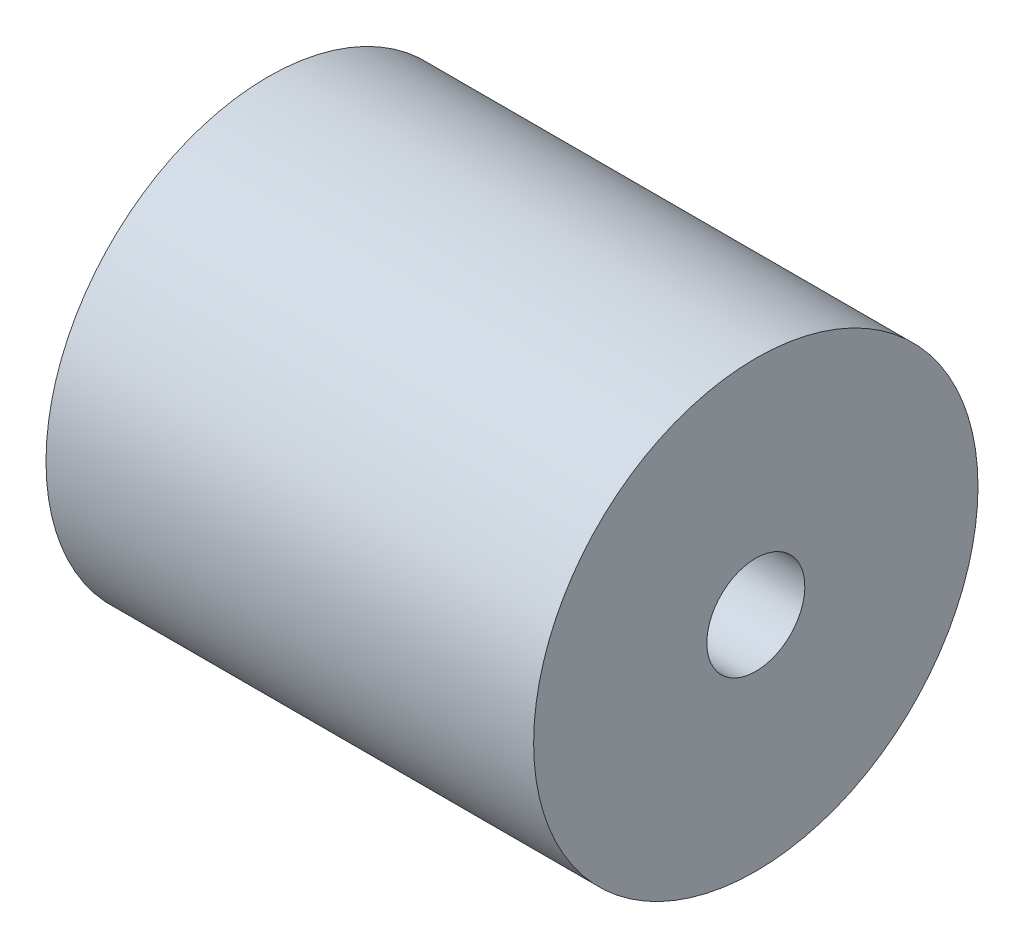
ISO-10303-21;
HEADER;
FILE_DESCRIPTION(('STEP AP214'),'2;1');
FILE_NAME('part.step','',(''),(''),'','','');
FILE_SCHEMA(('AUTOMOTIVE_DESIGN { 1 0 10303 214 1 1 1 1 }'));
ENDSEC;
DATA;
#1=APPLICATION_CONTEXT('core data for automotive mechanical design processes');
#2=APPLICATION_PROTOCOL_DEFINITION('international standard','automotive_design',2000,#1);
#3=PRODUCT_CONTEXT('',#1,'mechanical');
#4=PRODUCT('Part','Part','',(#3));
#5=PRODUCT_RELATED_PRODUCT_CATEGORY('part','',(#4));
#6=PRODUCT_DEFINITION_FORMATION('','',#4);
#7=PRODUCT_DEFINITION_CONTEXT('part definition',#1,'design');
#8=PRODUCT_DEFINITION('design','',#6,#7);
#9=PRODUCT_DEFINITION_SHAPE('','',#8);
#10=(LENGTH_UNIT() NAMED_UNIT(*) SI_UNIT(.MILLI.,.METRE.));
#11=(NAMED_UNIT(*) PLANE_ANGLE_UNIT() SI_UNIT($,.RADIAN.));
#12=(NAMED_UNIT(*) SI_UNIT($,.STERADIAN.) SOLID_ANGLE_UNIT());
#13=UNCERTAINTY_MEASURE_WITH_UNIT(LENGTH_MEASURE(1.E-05),#10,'distance_accuracy_value','');
#14=(GEOMETRIC_REPRESENTATION_CONTEXT(3) GLOBAL_UNCERTAINTY_ASSIGNED_CONTEXT((#13)) GLOBAL_UNIT_ASSIGNED_CONTEXT((#10,
#11,#12)) REPRESENTATION_CONTEXT('',''));
#15=CARTESIAN_POINT('',(0.,0.,0.));
#16=DIRECTION('',(0.,0.,1.));
#17=DIRECTION('',(1.,0.,0.));
#18=AXIS2_PLACEMENT_3D('',#15,#16,#17);
#19=CARTESIAN_POINT('',(-311.15,-241.3,206.88711980234));
#20=DIRECTION('',(-1.,0.,0.));
#21=DIRECTION('',(0.,-1.,0.));
#22=AXIS2_PLACEMENT_3D('',#19,#20,#21);
#23=CYLINDRICAL_SURFACE('',#22,2.5527);
#24=CARTESIAN_POINT('',(-311.15,-241.3,206.88711980234));
#25=DIRECTION('',(1.,0.,0.));
#26=DIRECTION('',(0.,1.,0.));
#27=AXIS2_PLACEMENT_3D('',#24,#25,#26);
#28=CIRCLE('',#27,2.5527);
#29=CARTESIAN_POINT('',(-311.15,-238.7473,206.88711980234));
#30=VERTEX_POINT('',#29);
#31=EDGE_CURVE('E23',#30,#30,#28,.T.);
#32=ORIENTED_EDGE('',*,*,#31,.T.);
#33=EDGE_LOOP('',(#32));
#34=FACE_BOUND('',#33,.T.);
#35=CARTESIAN_POINT('',(-336.55,-241.3,206.88711980234));
#36=DIRECTION('',(1.,0.,0.));
#37=DIRECTION('',(0.,1.,0.));
#38=AXIS2_PLACEMENT_3D('',#35,#36,#37);
#39=CIRCLE('',#38,2.5527);
#40=CARTESIAN_POINT('',(-336.55,-238.7473,206.88711980234));
#41=VERTEX_POINT('',#40);
#42=EDGE_CURVE('E31',#41,#41,#39,.T.);
#43=ORIENTED_EDGE('',*,*,#42,.F.);
#44=EDGE_LOOP('',(#43));
#45=FACE_BOUND('',#44,.T.);
#46=ADVANCED_FACE('F15',(#34,#45),#23,.F.);
#47=CARTESIAN_POINT('',(-311.15,-241.3,206.88711980234));
#48=DIRECTION('',(-1.,0.,0.));
#49=DIRECTION('',(0.,-1.,0.));
#50=AXIS2_PLACEMENT_3D('',#47,#48,#49);
#51=CYLINDRICAL_SURFACE('',#50,11.5728591633433);
#52=CARTESIAN_POINT('',(-311.15,-241.3,206.88711980234));
#53=DIRECTION('',(1.,0.,0.));
#54=DIRECTION('',(0.,1.,0.));
#55=AXIS2_PLACEMENT_3D('',#52,#53,#54);
#56=CIRCLE('',#55,11.5728591633433);
#57=CARTESIAN_POINT('',(-311.15,-229.727140836657,206.88711980234));
#58=VERTEX_POINT('',#57);
#59=EDGE_CURVE('E10',#58,#58,#56,.T.);
#60=ORIENTED_EDGE('',*,*,#59,.F.);
#61=EDGE_LOOP('',(#60));
#62=FACE_BOUND('',#61,.T.);
#63=CARTESIAN_POINT('',(-336.55,-241.3,206.88711980234));
#64=DIRECTION('',(1.,0.,0.));
#65=DIRECTION('',(0.,1.,0.));
#66=AXIS2_PLACEMENT_3D('',#63,#64,#65);
#67=CIRCLE('',#66,11.5728591633433);
#68=CARTESIAN_POINT('',(-336.55,-229.727140836657,206.88711980234));
#69=VERTEX_POINT('',#68);
#70=EDGE_CURVE('E18',#69,#69,#67,.T.);
#71=ORIENTED_EDGE('',*,*,#70,.T.);
#72=EDGE_LOOP('',(#71));
#73=FACE_BOUND('',#72,.T.);
#74=ADVANCED_FACE('F40',(#62,#73),#51,.T.);
#75=CARTESIAN_POINT('',(-311.15,-209.179105063928,244.892648268386));
#76=DIRECTION('',(1.,0.,0.));
#77=DIRECTION('',(0.,1.,0.));
#78=AXIS2_PLACEMENT_3D('',#75,#76,#77);
#79=PLANE('',#78);
#80=ORIENTED_EDGE('',*,*,#31,.F.);
#81=EDGE_LOOP('',(#80));
#82=FACE_BOUND('',#81,.T.);
#83=ORIENTED_EDGE('',*,*,#59,.T.);
#84=EDGE_LOOP('',(#83));
#85=FACE_BOUND('',#84,.T.);
#86=ADVANCED_FACE('F44',(#82,#85),#79,.T.);
#87=CARTESIAN_POINT('',(-336.55,-209.179105063928,244.892648268386));
#88=DIRECTION('',(1.,0.,0.));
#89=DIRECTION('',(0.,1.,0.));
#90=AXIS2_PLACEMENT_3D('',#87,#88,#89);
#91=PLANE('',#90);
#92=ORIENTED_EDGE('',*,*,#42,.T.);
#93=EDGE_LOOP('',(#92));
#94=FACE_BOUND('',#93,.T.);
#95=ORIENTED_EDGE('',*,*,#70,.F.);
#96=EDGE_LOOP('',(#95));
#97=FACE_BOUND('',#96,.T.);
#98=ADVANCED_FACE('F42',(#94,#97),#91,.F.);
#99=CLOSED_SHELL('',(#46,#74,#86,#98));
#100=MANIFOLD_SOLID_BREP('B1',#99);
#101=ADVANCED_BREP_SHAPE_REPRESENTATION('',(#18,#100),#14);
#102=SHAPE_DEFINITION_REPRESENTATION(#9,#101);
ENDSEC;
END-ISO-10303-21;
